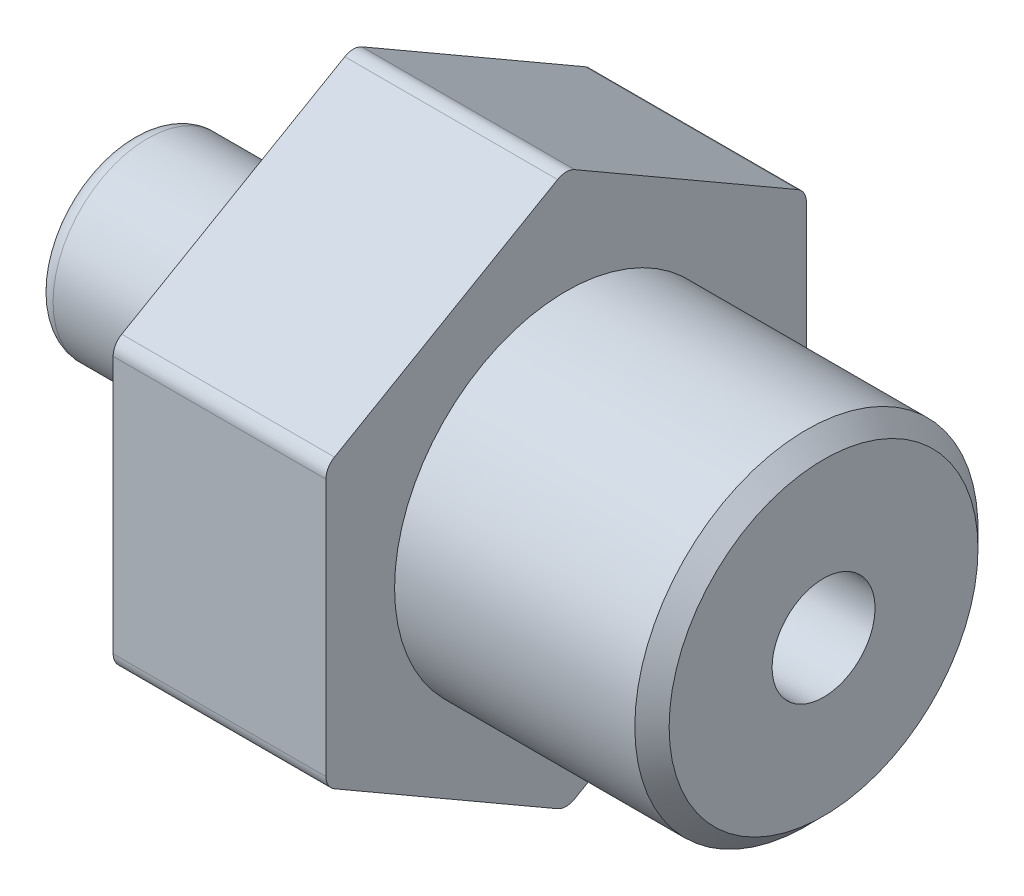
ISO-10303-21;
HEADER;
FILE_DESCRIPTION(('STEP AP214'),'2;1');
FILE_NAME('part.step','',(''),(''),'','','');
FILE_SCHEMA(('AUTOMOTIVE_DESIGN { 1 0 10303 214 1 1 1 1 }'));
ENDSEC;
DATA;
#1=APPLICATION_CONTEXT('core data for automotive mechanical design processes');
#2=APPLICATION_PROTOCOL_DEFINITION('international standard','automotive_design',2000,#1);
#3=PRODUCT_CONTEXT('',#1,'mechanical');
#4=PRODUCT('Part','Part','',(#3));
#5=PRODUCT_RELATED_PRODUCT_CATEGORY('part','',(#4));
#6=PRODUCT_DEFINITION_FORMATION('','',#4);
#7=PRODUCT_DEFINITION_CONTEXT('part definition',#1,'design');
#8=PRODUCT_DEFINITION('design','',#6,#7);
#9=PRODUCT_DEFINITION_SHAPE('','',#8);
#10=(LENGTH_UNIT() NAMED_UNIT(*) SI_UNIT(.MILLI.,.METRE.));
#11=(NAMED_UNIT(*) PLANE_ANGLE_UNIT() SI_UNIT($,.RADIAN.));
#12=(NAMED_UNIT(*) SI_UNIT($,.STERADIAN.) SOLID_ANGLE_UNIT());
#13=UNCERTAINTY_MEASURE_WITH_UNIT(LENGTH_MEASURE(1.E-05),#10,'distance_accuracy_value','');
#14=(GEOMETRIC_REPRESENTATION_CONTEXT(3) GLOBAL_UNCERTAINTY_ASSIGNED_CONTEXT((#13)) GLOBAL_UNIT_ASSIGNED_CONTEXT((#10,
#11,#12)) REPRESENTATION_CONTEXT('',''));
#15=CARTESIAN_POINT('',(0.,0.,0.));
#16=DIRECTION('',(0.,0.,1.));
#17=DIRECTION('',(1.,0.,0.));
#18=AXIS2_PLACEMENT_3D('',#15,#16,#17);
#19=CARTESIAN_POINT('',(-12.7,0.,0.));
#20=DIRECTION('',(-1.,0.,0.));
#21=DIRECTION('',(0.,0.,1.));
#22=AXIS2_PLACEMENT_3D('',#19,#20,#21);
#23=PLANE('',#22);
#24=CARTESIAN_POINT('',(-12.7,0.,0.));
#25=DIRECTION('',(-1.,0.,0.));
#26=DIRECTION('',(0.,0.,1.));
#27=AXIS2_PLACEMENT_3D('',#24,#25,#26);
#28=CIRCLE('',#27,2.25);
#29=CARTESIAN_POINT('',(-12.7,0.,2.25));
#30=VERTEX_POINT('',#29);
#31=EDGE_CURVE('E51',#30,#30,#28,.T.);
#32=ORIENTED_EDGE('',*,*,#31,.T.);
#33=EDGE_LOOP('',(#32));
#34=FACE_BOUND('',#33,.T.);
#35=CARTESIAN_POINT('',(-12.7,0.,0.));
#36=DIRECTION('',(-1.,0.,0.));
#37=DIRECTION('',(0.,0.,1.));
#38=AXIS2_PLACEMENT_3D('',#35,#36,#37);
#39=CIRCLE('',#38,1.5);
#40=CARTESIAN_POINT('',(-12.7,0.,-1.5));
#41=VERTEX_POINT('',#40);
#42=EDGE_CURVE('E59',#41,#41,#39,.T.);
#43=ORIENTED_EDGE('',*,*,#42,.F.);
#44=EDGE_LOOP('',(#43));
#45=FACE_BOUND('',#44,.T.);
#46=ADVANCED_FACE('F44',(#34,#45),#23,.T.);
#47=CARTESIAN_POINT('',(-6.2,0.,0.));
#48=DIRECTION('',(-1.,0.,0.));
#49=DIRECTION('',(0.,0.,1.));
#50=AXIS2_PLACEMENT_3D('',#47,#48,#49);
#51=PLANE('',#50);
#52=CARTESIAN_POINT('',(-6.2,0.,0.));
#53=DIRECTION('',(-1.,0.,0.));
#54=DIRECTION('',(0.,0.,1.));
#55=AXIS2_PLACEMENT_3D('',#52,#53,#54);
#56=CIRCLE('',#55,2.75);
#57=CARTESIAN_POINT('',(-6.2,0.,-2.75));
#58=VERTEX_POINT('',#57);
#59=EDGE_CURVE('E55',#58,#58,#56,.T.);
#60=ORIENTED_EDGE('',*,*,#59,.F.);
#61=EDGE_LOOP('',(#60));
#62=FACE_BOUND('',#61,.T.);
#63=CARTESIAN_POINT('',(-6.2,0.,0.));
#64=DIRECTION('',(-1.,0.,0.));
#65=DIRECTION('',(0.,0.,1.));
#66=AXIS2_PLACEMENT_3D('',#63,#64,#65);
#67=CIRCLE('',#66,1.5);
#68=CARTESIAN_POINT('',(-6.2,0.,-1.5));
#69=VERTEX_POINT('',#68);
#70=EDGE_CURVE('E62',#69,#69,#67,.T.);
#71=ORIENTED_EDGE('',*,*,#70,.T.);
#72=EDGE_LOOP('',(#71));
#73=FACE_BOUND('',#72,.T.);
#74=ADVANCED_FACE('F72',(#62,#73),#51,.F.);
#75=CARTESIAN_POINT('',(-12.7,0.,0.));
#76=DIRECTION('',(1.,0.,0.));
#77=DIRECTION('',(0.,0.,-1.));
#78=AXIS2_PLACEMENT_3D('',#75,#76,#77);
#79=CYLINDRICAL_SURFACE('',#78,2.75);
#80=CARTESIAN_POINT('',(-12.2,0.,0.));
#81=DIRECTION('',(-1.,0.,0.));
#82=DIRECTION('',(0.,0.,1.));
#83=AXIS2_PLACEMENT_3D('',#80,#81,#82);
#84=CIRCLE('',#83,2.75);
#85=CARTESIAN_POINT('',(-12.2,0.,-2.75));
#86=VERTEX_POINT('',#85);
#87=EDGE_CURVE('E11',#86,#86,#84,.F.);
#88=CARTESIAN_POINT('',(-12.2,0.,-2.75));
#89=CARTESIAN_POINT('',(-12.1375,0.,-2.75));
#90=CARTESIAN_POINT('',(-12.075,0.,-2.75));
#91=CARTESIAN_POINT('',(-11.95,0.,-2.75));
#92=CARTESIAN_POINT('',(-11.8875,0.,-2.75));
#93=CARTESIAN_POINT('',(-11.7625,0.,-2.75));
#94=CARTESIAN_POINT('',(-11.7,0.,-2.75));
#95=CARTESIAN_POINT('',(-11.575,0.,-2.75));
#96=CARTESIAN_POINT('',(-11.5125,0.,-2.75));
#97=CARTESIAN_POINT('',(-11.3875,0.,-2.75));
#98=CARTESIAN_POINT('',(-11.325,0.,-2.75));
#99=CARTESIAN_POINT('',(-11.2,0.,-2.75));
#100=CARTESIAN_POINT('',(-11.1375,0.,-2.75));
#101=CARTESIAN_POINT('',(-11.0125,0.,-2.75));
#102=CARTESIAN_POINT('',(-10.95,0.,-2.75));
#103=CARTESIAN_POINT('',(-10.825,0.,-2.75));
#104=CARTESIAN_POINT('',(-10.7625,0.,-2.75));
#105=CARTESIAN_POINT('',(-10.6375,0.,-2.75));
#106=CARTESIAN_POINT('',(-10.575,0.,-2.75));
#107=CARTESIAN_POINT('',(-10.45,0.,-2.75));
#108=CARTESIAN_POINT('',(-10.3875,0.,-2.75));
#109=CARTESIAN_POINT('',(-10.2625,0.,-2.75));
#110=CARTESIAN_POINT('',(-10.2,0.,-2.75));
#111=CARTESIAN_POINT('',(-10.075,0.,-2.75));
#112=CARTESIAN_POINT('',(-10.0125,0.,-2.75));
#113=CARTESIAN_POINT('',(-9.8875,0.,-2.75));
#114=CARTESIAN_POINT('',(-9.825,0.,-2.75));
#115=CARTESIAN_POINT('',(-9.7,0.,-2.75));
#116=CARTESIAN_POINT('',(-9.6375,0.,-2.75));
#117=CARTESIAN_POINT('',(-9.5125,0.,-2.75));
#118=CARTESIAN_POINT('',(-9.45,0.,-2.75));
#119=CARTESIAN_POINT('',(-9.325,0.,-2.75));
#120=CARTESIAN_POINT('',(-9.2625,0.,-2.75));
#121=CARTESIAN_POINT('',(-9.1375,0.,-2.75));
#122=CARTESIAN_POINT('',(-9.075,0.,-2.75));
#123=CARTESIAN_POINT('',(-8.95,0.,-2.75));
#124=CARTESIAN_POINT('',(-8.8875,0.,-2.75));
#125=CARTESIAN_POINT('',(-8.7625,0.,-2.75));
#126=CARTESIAN_POINT('',(-8.7,0.,-2.75));
#127=CARTESIAN_POINT('',(-8.575,0.,-2.75));
#128=CARTESIAN_POINT('',(-8.5125,0.,-2.75));
#129=CARTESIAN_POINT('',(-8.3875,0.,-2.75));
#130=CARTESIAN_POINT('',(-8.325,0.,-2.75));
#131=CARTESIAN_POINT('',(-8.2,0.,-2.75));
#132=CARTESIAN_POINT('',(-8.1375,0.,-2.75));
#133=CARTESIAN_POINT('',(-8.0125,0.,-2.75));
#134=CARTESIAN_POINT('',(-7.95,0.,-2.75));
#135=CARTESIAN_POINT('',(-7.825,0.,-2.75));
#136=CARTESIAN_POINT('',(-7.7625,0.,-2.75));
#137=CARTESIAN_POINT('',(-7.6375,0.,-2.75));
#138=CARTESIAN_POINT('',(-7.575,0.,-2.75));
#139=CARTESIAN_POINT('',(-7.45,0.,-2.75));
#140=CARTESIAN_POINT('',(-7.3875,0.,-2.75));
#141=CARTESIAN_POINT('',(-7.2625,0.,-2.75));
#142=CARTESIAN_POINT('',(-7.2,0.,-2.75));
#143=CARTESIAN_POINT('',(-7.075,0.,-2.75));
#144=CARTESIAN_POINT('',(-7.0125,0.,-2.75));
#145=CARTESIAN_POINT('',(-6.8875,0.,-2.75));
#146=CARTESIAN_POINT('',(-6.825,0.,-2.75));
#147=CARTESIAN_POINT('',(-6.7,0.,-2.75));
#148=CARTESIAN_POINT('',(-6.6375,0.,-2.75));
#149=CARTESIAN_POINT('',(-6.5125,0.,-2.75));
#150=CARTESIAN_POINT('',(-6.45,0.,-2.75));
#151=CARTESIAN_POINT('',(-6.325,0.,-2.75));
#152=CARTESIAN_POINT('',(-6.2625,0.,-2.75));
#153=CARTESIAN_POINT('',(-6.2,0.,-2.75));
#154=B_SPLINE_CURVE_WITH_KNOTS('',3,(#88,#89,#90,#91,#92,#93,#94,#95,#96,#97,#98,#99,#100,#101,
#102,#103,#104,#105,#106,#107,#108,#109,#110,#111,#112,#113,#114,#115,#116,#117,#118,#119,#120,
#121,#122,#123,#124,#125,#126,#127,#128,#129,#130,#131,#132,#133,#134,#135,#136,#137,#138,#139,
#140,#141,#142,#143,#144,#145,#146,#147,#148,#149,#150,#151,#152,#153),.UNSPECIFIED.,.F.,.F.,(4,
2,2,2,2,2,2,2,2,2,2,2,2,2,2,2,2,2,2,2,2,2,2,2,2,2,2,2,2,2,2,2,4),(0.,0.187499999999998,
0.374999999999999,0.562499999999999,0.749999999999999,0.937499999999999,1.125,1.3125,1.5,1.6875,
1.875,2.0625,2.25,2.4375,2.625,2.8125,3.,3.1875,3.375,3.5625,3.75,3.9375,4.125,4.3125,4.5,
4.6875,4.875,5.0625,5.25,5.4375,5.625,5.8125,6.),.UNSPECIFIED.);
#155=EDGE_CURVE('BSEAM77',#86,#58,#154,.T.);
#156=ORIENTED_EDGE('',*,*,#87,.T.);
#157=ORIENTED_EDGE('',*,*,#59,.T.);
#158=ORIENTED_EDGE('',*,*,#155,.T.);
#159=ORIENTED_EDGE('',*,*,#155,.F.);
#160=EDGE_LOOP('',(#156,#158,#157,#159));
#161=FACE_BOUND('',#160,.T.);
#162=ADVANCED_FACE('F77',(#161),#79,.T.);
#163=CARTESIAN_POINT('',(-12.7,0.,0.));
#164=DIRECTION('',(1.,0.,0.));
#165=DIRECTION('',(0.,0.,-1.));
#166=AXIS2_PLACEMENT_3D('',#163,#164,#165);
#167=CYLINDRICAL_SURFACE('',#166,1.5);
#168=CARTESIAN_POINT('',(-12.7,0.,-1.5));
#169=CARTESIAN_POINT('',(-12.6322916666667,0.,-1.5));
#170=CARTESIAN_POINT('',(-12.5645833333333,0.,-1.5));
#171=CARTESIAN_POINT('',(-12.4291666666667,0.,-1.5));
#172=CARTESIAN_POINT('',(-12.3614583333333,0.,-1.5));
#173=CARTESIAN_POINT('',(-12.2260416666667,0.,-1.5));
#174=CARTESIAN_POINT('',(-12.1583333333333,0.,-1.5));
#175=CARTESIAN_POINT('',(-12.0229166666667,0.,-1.5));
#176=CARTESIAN_POINT('',(-11.9552083333333,0.,-1.5));
#177=CARTESIAN_POINT('',(-11.8197916666667,0.,-1.5));
#178=CARTESIAN_POINT('',(-11.7520833333333,0.,-1.5));
#179=CARTESIAN_POINT('',(-11.6166666666667,0.,-1.5));
#180=CARTESIAN_POINT('',(-11.5489583333333,0.,-1.5));
#181=CARTESIAN_POINT('',(-11.4135416666667,0.,-1.5));
#182=CARTESIAN_POINT('',(-11.3458333333333,0.,-1.5));
#183=CARTESIAN_POINT('',(-11.2104166666667,0.,-1.5));
#184=CARTESIAN_POINT('',(-11.1427083333333,0.,-1.5));
#185=CARTESIAN_POINT('',(-11.0072916666667,0.,-1.5));
#186=CARTESIAN_POINT('',(-10.9395833333333,0.,-1.5));
#187=CARTESIAN_POINT('',(-10.8041666666667,0.,-1.5));
#188=CARTESIAN_POINT('',(-10.7364583333333,0.,-1.5));
#189=CARTESIAN_POINT('',(-10.6010416666667,0.,-1.5));
#190=CARTESIAN_POINT('',(-10.5333333333333,0.,-1.5));
#191=CARTESIAN_POINT('',(-10.3979166666667,0.,-1.5));
#192=CARTESIAN_POINT('',(-10.3302083333333,0.,-1.5));
#193=CARTESIAN_POINT('',(-10.1947916666667,0.,-1.5));
#194=CARTESIAN_POINT('',(-10.1270833333333,0.,-1.5));
#195=CARTESIAN_POINT('',(-9.99166666666667,0.,-1.5));
#196=CARTESIAN_POINT('',(-9.92395833333333,0.,-1.5));
#197=CARTESIAN_POINT('',(-9.78854166666667,0.,-1.5));
#198=CARTESIAN_POINT('',(-9.72083333333333,0.,-1.5));
#199=CARTESIAN_POINT('',(-9.58541666666667,0.,-1.5));
#200=CARTESIAN_POINT('',(-9.51770833333333,0.,-1.5));
#201=CARTESIAN_POINT('',(-9.38229166666667,0.,-1.5));
#202=CARTESIAN_POINT('',(-9.31458333333333,0.,-1.5));
#203=CARTESIAN_POINT('',(-9.17916666666667,0.,-1.5));
#204=CARTESIAN_POINT('',(-9.11145833333333,0.,-1.5));
#205=CARTESIAN_POINT('',(-8.97604166666667,0.,-1.5));
#206=CARTESIAN_POINT('',(-8.90833333333333,0.,-1.5));
#207=CARTESIAN_POINT('',(-8.77291666666667,0.,-1.5));
#208=CARTESIAN_POINT('',(-8.70520833333333,0.,-1.5));
#209=CARTESIAN_POINT('',(-8.56979166666667,0.,-1.5));
#210=CARTESIAN_POINT('',(-8.50208333333333,0.,-1.5));
#211=CARTESIAN_POINT('',(-8.36666666666667,0.,-1.5));
#212=CARTESIAN_POINT('',(-8.29895833333333,0.,-1.5));
#213=CARTESIAN_POINT('',(-8.16354166666667,0.,-1.5));
#214=CARTESIAN_POINT('',(-8.09583333333333,0.,-1.5));
#215=CARTESIAN_POINT('',(-7.96041666666667,0.,-1.5));
#216=CARTESIAN_POINT('',(-7.89270833333333,0.,-1.5));
#217=CARTESIAN_POINT('',(-7.75729166666667,0.,-1.5));
#218=CARTESIAN_POINT('',(-7.68958333333333,0.,-1.5));
#219=CARTESIAN_POINT('',(-7.55416666666667,0.,-1.5));
#220=CARTESIAN_POINT('',(-7.48645833333333,0.,-1.5));
#221=CARTESIAN_POINT('',(-7.35104166666667,0.,-1.5));
#222=CARTESIAN_POINT('',(-7.28333333333333,0.,-1.5));
#223=CARTESIAN_POINT('',(-7.14791666666667,0.,-1.5));
#224=CARTESIAN_POINT('',(-7.08020833333333,0.,-1.5));
#225=CARTESIAN_POINT('',(-6.94479166666667,0.,-1.5));
#226=CARTESIAN_POINT('',(-6.87708333333333,0.,-1.5));
#227=CARTESIAN_POINT('',(-6.74166666666667,0.,-1.5));
#228=CARTESIAN_POINT('',(-6.67395833333333,0.,-1.5));
#229=CARTESIAN_POINT('',(-6.53854166666667,0.,-1.5));
#230=CARTESIAN_POINT('',(-6.47083333333333,0.,-1.5));
#231=CARTESIAN_POINT('',(-6.33541666666667,0.,-1.5));
#232=CARTESIAN_POINT('',(-6.26770833333333,0.,-1.5));
#233=CARTESIAN_POINT('',(-6.2,0.,-1.5));
#234=B_SPLINE_CURVE_WITH_KNOTS('',3,(#168,#169,#170,#171,#172,#173,#174,#175,#176,#177,#178,
#179,#180,#181,#182,#183,#184,#185,#186,#187,#188,#189,#190,#191,#192,#193,#194,#195,#196,#197,
#198,#199,#200,#201,#202,#203,#204,#205,#206,#207,#208,#209,#210,#211,#212,#213,#214,#215,#216,
#217,#218,#219,#220,#221,#222,#223,#224,#225,#226,#227,#228,#229,#230,#231,#232,#233),
.UNSPECIFIED.,.F.,.F.,(4,2,2,2,2,2,2,2,2,2,2,2,2,2,2,2,2,2,2,2,2,2,2,2,2,2,2,2,2,2,2,2,4),(0.,
0.203125,0.40625,0.609375000000001,0.812500000000001,1.015625,1.21875,1.421875,1.625,1.828125,
2.03125,2.234375,2.4375,2.640625,2.84375,3.046875,3.25,3.453125,3.65625,3.859375,4.0625,
4.265625,4.46875,4.671875,4.875,5.078125,5.28125,5.484375,5.6875,5.890625,6.09375,6.296875,6.5),.UNSPECIFIED.);
#235=EDGE_CURVE('BSEAM68',#41,#69,#234,.T.);
#236=ORIENTED_EDGE('',*,*,#42,.T.);
#237=ORIENTED_EDGE('',*,*,#70,.F.);
#238=ORIENTED_EDGE('',*,*,#235,.T.);
#239=ORIENTED_EDGE('',*,*,#235,.F.);
#240=EDGE_LOOP('',(#236,#238,#237,#239));
#241=FACE_BOUND('',#240,.T.);
#242=ADVANCED_FACE('F68',(#241),#167,.F.);
#243=CARTESIAN_POINT('',(-12.2,0.,0.));
#244=DIRECTION('',(-1.,0.,0.));
#245=DIRECTION('',(0.,0.,1.));
#246=AXIS2_PLACEMENT_3D('',#243,#244,#245);
#247=TOROIDAL_SURFACE('',#246,2.25,0.5);
#248=ORIENTED_EDGE('',*,*,#87,.F.);
#249=EDGE_LOOP('',(#248));
#250=FACE_BOUND('',#249,.T.);
#251=ORIENTED_EDGE('',*,*,#31,.F.);
#252=EDGE_LOOP('',(#251));
#253=FACE_BOUND('',#252,.T.);
#254=ADVANCED_FACE('F46',(#250,#253),#247,.T.);
#255=CLOSED_SHELL('',(#46,#74,#162,#242,#254));
#256=MANIFOLD_SOLID_BREP('B2',#255);
#257=CARTESIAN_POINT('',(0.,0.,0.));
#258=DIRECTION('',(-1.,0.,0.));
#259=DIRECTION('',(0.,0.,1.));
#260=AXIS2_PLACEMENT_3D('',#257,#258,#259);
#261=CYLINDRICAL_SURFACE('',#260,5.);
#262=CARTESIAN_POINT('',(7.,0.,0.));
#263=DIRECTION('',(-1.,0.,0.));
#264=DIRECTION('',(0.,0.,1.));
#265=AXIS2_PLACEMENT_3D('',#262,#263,#264);
#266=CIRCLE('',#265,5.);
#267=CARTESIAN_POINT('',(7.,0.,5.));
#268=VERTEX_POINT('',#267);
#269=EDGE_CURVE('E256',#268,#268,#266,.T.);
#270=ORIENTED_EDGE('',*,*,#269,.T.);
#271=EDGE_LOOP('',(#270));
#272=FACE_BOUND('',#271,.T.);
#273=CARTESIAN_POINT('',(0.,0.,0.));
#274=DIRECTION('',(-1.,0.,0.));
#275=DIRECTION('',(0.,0.,1.));
#276=AXIS2_PLACEMENT_3D('',#273,#274,#275);
#277=CIRCLE('',#276,5.);
#278=CARTESIAN_POINT('',(0.,0.,5.));
#279=VERTEX_POINT('',#278);
#280=EDGE_CURVE('E253',#279,#279,#277,.T.);
#281=ORIENTED_EDGE('',*,*,#280,.F.);
#282=EDGE_LOOP('',(#281));
#283=FACE_BOUND('',#282,.T.);
#284=ADVANCED_FACE('F120',(#272,#283),#261,.T.);
#285=CARTESIAN_POINT('',(0.,0.,0.));
#286=DIRECTION('',(1.,0.,0.));
#287=DIRECTION('',(0.,0.,-1.));
#288=AXIS2_PLACEMENT_3D('',#285,#286,#287);
#289=PLANE('',#288);
#290=CARTESIAN_POINT('',(0.,0.,0.));
#291=DIRECTION('',(-1.,0.,0.));
#292=DIRECTION('',(0.,0.,1.));
#293=AXIS2_PLACEMENT_3D('',#290,#291,#292);
#294=CIRCLE('',#293,3.);
#295=CARTESIAN_POINT('',(0.,0.,-3.));
#296=VERTEX_POINT('',#295);
#297=EDGE_CURVE('E330',#296,#296,#294,.T.);
#298=ORIENTED_EDGE('',*,*,#297,.T.);
#299=EDGE_LOOP('',(#298));
#300=FACE_BOUND('',#299,.T.);
#301=CARTESIAN_POINT('',(0.,0.,0.));
#302=DIRECTION('',(-1.,0.,0.));
#303=DIRECTION('',(0.,0.,1.));
#304=AXIS2_PLACEMENT_3D('',#301,#302,#303);
#305=CIRCLE('',#304,1.5);
#306=CARTESIAN_POINT('',(0.,0.,1.5));
#307=VERTEX_POINT('',#306);
#308=EDGE_CURVE('E250',#307,#307,#305,.T.);
#309=ORIENTED_EDGE('',*,*,#308,.F.);
#310=EDGE_LOOP('',(#309));
#311=FACE_BOUND('',#310,.T.);
#312=ADVANCED_FACE('F354',(#300,#311),#289,.F.);
#313=CARTESIAN_POINT('',(0.,0.,0.));
#314=DIRECTION('',(-1.,0.,0.));
#315=DIRECTION('',(0.,0.,1.));
#316=AXIS2_PLACEMENT_3D('',#313,#314,#315);
#317=CYLINDRICAL_SURFACE('',#316,1.5);
#318=ORIENTED_EDGE('',*,*,#308,.T.);
#319=EDGE_LOOP('',(#318));
#320=FACE_BOUND('',#319,.T.);
#321=CARTESIAN_POINT('',(7.5,0.,0.));
#322=DIRECTION('',(-1.,0.,0.));
#323=DIRECTION('',(0.,0.,1.));
#324=AXIS2_PLACEMENT_3D('',#321,#322,#323);
#325=CIRCLE('',#324,1.5);
#326=CARTESIAN_POINT('',(7.5,0.,1.5));
#327=VERTEX_POINT('',#326);
#328=EDGE_CURVE('E247',#327,#327,#325,.T.);
#329=ORIENTED_EDGE('',*,*,#328,.F.);
#330=EDGE_LOOP('',(#329));
#331=FACE_BOUND('',#330,.T.);
#332=ADVANCED_FACE('F360',(#320,#331),#317,.F.);
#333=CARTESIAN_POINT('',(7.5,0.,0.));
#334=DIRECTION('',(-1.,0.,0.));
#335=DIRECTION('',(0.,0.,1.));
#336=AXIS2_PLACEMENT_3D('',#333,#334,#335);
#337=PLANE('',#336);
#338=CARTESIAN_POINT('',(7.5,0.,0.));
#339=DIRECTION('',(-1.,0.,0.));
#340=DIRECTION('',(0.,0.,1.));
#341=AXIS2_PLACEMENT_3D('',#338,#339,#340);
#342=CIRCLE('',#341,4.5);
#343=CARTESIAN_POINT('',(7.5,0.,4.5));
#344=VERTEX_POINT('',#343);
#345=EDGE_CURVE('E259',#344,#344,#342,.F.);
#346=ORIENTED_EDGE('',*,*,#345,.T.);
#347=EDGE_LOOP('',(#346));
#348=FACE_BOUND('',#347,.T.);
#349=ORIENTED_EDGE('',*,*,#328,.T.);
#350=EDGE_LOOP('',(#349));
#351=FACE_BOUND('',#350,.T.);
#352=ADVANCED_FACE('F350',(#348,#351),#337,.F.);
#353=CARTESIAN_POINT('',(0.,0.,0.));
#354=DIRECTION('',(-1.,0.,0.));
#355=DIRECTION('',(0.,0.,1.));
#356=AXIS2_PLACEMENT_3D('',#353,#354,#355);
#357=PLANE('',#356);
#358=DIRECTION('',(0.,1.,0.));
#359=VECTOR('',#358,1.);
#360=CARTESIAN_POINT('',(0.,-4.04145188432738,7.));
#361=LINE('',#360,#359);
#362=CARTESIAN_POINT('',(0.,-3.75277674973257,7.));
#363=VERTEX_POINT('',#362);
#364=CARTESIAN_POINT('',(0.,3.75277674973257,7.));
#365=VERTEX_POINT('',#364);
#366=EDGE_CURVE('E227',#363,#365,#361,.T.);
#367=ORIENTED_EDGE('',*,*,#366,.F.);
#368=CARTESIAN_POINT('',(0.,-3.75277674973257,6.5));
#369=DIRECTION('',(-1.,0.,0.));
#370=DIRECTION('',(0.,0.,1.));
#371=AXIS2_PLACEMENT_3D('',#368,#369,#370);
#372=CIRCLE('',#371,0.5);
#373=CARTESIAN_POINT('',(0.,-4.18578945162479,6.75));
#374=VERTEX_POINT('',#373);
#375=EDGE_CURVE('E210',#363,#374,#372,.F.);
#376=ORIENTED_EDGE('',*,*,#375,.T.);
#377=DIRECTION('',(0.,0.5,0.866025403784439));
#378=VECTOR('',#377,1.);
#379=CARTESIAN_POINT('',(0.,-8.08290376865476,0.));
#380=LINE('',#379,#378);
#381=CARTESIAN_POINT('',(0.,-7.93856620135736,0.249999999999996));
#382=VERTEX_POINT('',#381);
#383=EDGE_CURVE('E238',#382,#374,#380,.T.);
#384=ORIENTED_EDGE('',*,*,#383,.F.);
#385=CARTESIAN_POINT('',(0.,-7.50555349946514,0.));
#386=DIRECTION('',(-1.,0.,0.));
#387=DIRECTION('',(0.,0.,1.));
#388=AXIS2_PLACEMENT_3D('',#385,#386,#387);
#389=CIRCLE('',#388,0.5);
#390=CARTESIAN_POINT('',(0.,-7.93856620135736,-0.250000000000005));
#391=VERTEX_POINT('',#390);
#392=EDGE_CURVE('E231',#382,#391,#389,.F.);
#393=ORIENTED_EDGE('',*,*,#392,.T.);
#394=DIRECTION('',(0.,-0.5,0.866025403784438));
#395=VECTOR('',#394,1.);
#396=CARTESIAN_POINT('',(0.,-4.04145188432738,-7.));
#397=LINE('',#396,#395);
#398=CARTESIAN_POINT('',(0.,-4.18578945162479,-6.75));
#399=VERTEX_POINT('',#398);
#400=EDGE_CURVE('E243',#399,#391,#397,.T.);
#401=ORIENTED_EDGE('',*,*,#400,.F.);
#402=CARTESIAN_POINT('',(0.,-3.75277674973257,-6.5));
#403=DIRECTION('',(-1.,0.,0.));
#404=DIRECTION('',(0.,0.,1.));
#405=AXIS2_PLACEMENT_3D('',#402,#403,#404);
#406=CIRCLE('',#405,0.5);
#407=CARTESIAN_POINT('',(0.,-3.75277674973257,-7.));
#408=VERTEX_POINT('',#407);
#409=EDGE_CURVE('E264',#399,#408,#406,.F.);
#410=ORIENTED_EDGE('',*,*,#409,.T.);
#411=DIRECTION('',(0.,-1.,0.));
#412=VECTOR('',#411,1.);
#413=CARTESIAN_POINT('',(0.,4.04145188432739,-7.));
#414=LINE('',#413,#412);
#415=CARTESIAN_POINT('',(0.,3.75277674973257,-7.));
#416=VERTEX_POINT('',#415);
#417=EDGE_CURVE('E305',#416,#408,#414,.T.);
#418=ORIENTED_EDGE('',*,*,#417,.F.);
#419=CARTESIAN_POINT('',(0.,3.75277674973257,-6.5));
#420=DIRECTION('',(-1.,0.,0.));
#421=DIRECTION('',(0.,0.,1.));
#422=AXIS2_PLACEMENT_3D('',#419,#420,#421);
#423=CIRCLE('',#422,0.5);
#424=CARTESIAN_POINT('',(0.,4.18578945162479,-6.75));
#425=VERTEX_POINT('',#424);
#426=EDGE_CURVE('E266',#416,#425,#423,.F.);
#427=ORIENTED_EDGE('',*,*,#426,.T.);
#428=DIRECTION('',(0.,-0.5,-0.866025403784439));
#429=VECTOR('',#428,1.);
#430=CARTESIAN_POINT('',(0.,8.08290376865476,0.));
#431=LINE('',#430,#429);
#432=CARTESIAN_POINT('',(0.,7.93856620135736,-0.250000000000002));
#433=VERTEX_POINT('',#432);
#434=EDGE_CURVE('E313',#433,#425,#431,.T.);
#435=ORIENTED_EDGE('',*,*,#434,.F.);
#436=CARTESIAN_POINT('',(0.,7.50555349946514,0.));
#437=DIRECTION('',(-1.,0.,0.));
#438=DIRECTION('',(0.,0.,1.));
#439=AXIS2_PLACEMENT_3D('',#436,#437,#438);
#440=CIRCLE('',#439,0.5);
#441=CARTESIAN_POINT('',(0.,7.93856620135736,0.249999999999999));
#442=VERTEX_POINT('',#441);
#443=EDGE_CURVE('E268',#433,#442,#440,.F.);
#444=ORIENTED_EDGE('',*,*,#443,.T.);
#445=DIRECTION('',(0.,0.5,-0.866025403784439));
#446=VECTOR('',#445,1.);
#447=CARTESIAN_POINT('',(0.,4.04145188432738,7.));
#448=LINE('',#447,#446);
#449=CARTESIAN_POINT('',(0.,4.18578945162479,6.75));
#450=VERTEX_POINT('',#449);
#451=EDGE_CURVE('E315',#450,#442,#448,.T.);
#452=ORIENTED_EDGE('',*,*,#451,.F.);
#453=CARTESIAN_POINT('',(0.,3.75277674973257,6.5));
#454=DIRECTION('',(-1.,0.,0.));
#455=DIRECTION('',(0.,0.,1.));
#456=AXIS2_PLACEMENT_3D('',#453,#454,#455);
#457=CIRCLE('',#456,0.5);
#458=EDGE_CURVE('E221',#450,#365,#457,.F.);
#459=ORIENTED_EDGE('',*,*,#458,.T.);
#460=EDGE_LOOP('',(#367,#376,#384,#393,#401,#410,#418,#427,#435,#444,#452,#459));
#461=FACE_BOUND('',#460,.T.);
#462=ORIENTED_EDGE('',*,*,#280,.T.);
#463=EDGE_LOOP('',(#462));
#464=FACE_BOUND('',#463,.T.);
#465=ADVANCED_FACE('F234',(#461,#464),#357,.F.);
#466=CARTESIAN_POINT('',(-6.2,0.,0.));
#467=DIRECTION('',(-1.,0.,0.));
#468=DIRECTION('',(0.,0.,1.));
#469=AXIS2_PLACEMENT_3D('',#466,#467,#468);
#470=PLANE('',#469);
#471=DIRECTION('',(0.,0.5,0.866025403784439));
#472=VECTOR('',#471,1.);
#473=CARTESIAN_POINT('',(-6.2,-8.08290376865476,0.));
#474=LINE('',#473,#472);
#475=CARTESIAN_POINT('',(-6.2,-7.93856620135736,0.249999999999996));
#476=VERTEX_POINT('',#475);
#477=CARTESIAN_POINT('',(-6.2,-4.18578945162479,6.75));
#478=VERTEX_POINT('',#477);
#479=EDGE_CURVE('E322',#476,#478,#474,.T.);
#480=ORIENTED_EDGE('',*,*,#479,.T.);
#481=CARTESIAN_POINT('',(-6.2,-3.75277674973257,6.5));
#482=DIRECTION('',(-1.,0.,0.));
#483=DIRECTION('',(0.,0.,1.));
#484=AXIS2_PLACEMENT_3D('',#481,#482,#483);
#485=CIRCLE('',#484,0.5);
#486=CARTESIAN_POINT('',(-6.2,-3.75277674973257,7.));
#487=VERTEX_POINT('',#486);
#488=EDGE_CURVE('E283',#478,#487,#485,.T.);
#489=ORIENTED_EDGE('',*,*,#488,.T.);
#490=DIRECTION('',(0.,1.,0.));
#491=VECTOR('',#490,1.);
#492=CARTESIAN_POINT('',(-6.2,-4.04145188432738,7.));
#493=LINE('',#492,#491);
#494=CARTESIAN_POINT('',(-6.2,3.75277674973257,7.));
#495=VERTEX_POINT('',#494);
#496=EDGE_CURVE('E230',#487,#495,#493,.T.);
#497=ORIENTED_EDGE('',*,*,#496,.T.);
#498=CARTESIAN_POINT('',(-6.2,3.75277674973257,6.5));
#499=DIRECTION('',(-1.,0.,0.));
#500=DIRECTION('',(0.,0.,1.));
#501=AXIS2_PLACEMENT_3D('',#498,#499,#500);
#502=CIRCLE('',#501,0.5);
#503=CARTESIAN_POINT('',(-6.2,4.18578945162479,6.75));
#504=VERTEX_POINT('',#503);
#505=EDGE_CURVE('E281',#495,#504,#502,.T.);
#506=ORIENTED_EDGE('',*,*,#505,.T.);
#507=DIRECTION('',(0.,0.5,-0.866025403784439));
#508=VECTOR('',#507,1.);
#509=CARTESIAN_POINT('',(-6.2,4.04145188432738,7.));
#510=LINE('',#509,#508);
#511=CARTESIAN_POINT('',(-6.2,7.93856620135736,0.249999999999999));
#512=VERTEX_POINT('',#511);
#513=EDGE_CURVE('E237',#504,#512,#510,.T.);
#514=ORIENTED_EDGE('',*,*,#513,.T.);
#515=CARTESIAN_POINT('',(-6.2,7.50555349946514,0.));
#516=DIRECTION('',(-1.,0.,0.));
#517=DIRECTION('',(0.,0.,1.));
#518=AXIS2_PLACEMENT_3D('',#515,#516,#517);
#519=CIRCLE('',#518,0.5);
#520=CARTESIAN_POINT('',(-6.2,7.93856620135736,-0.250000000000002));
#521=VERTEX_POINT('',#520);
#522=EDGE_CURVE('E279',#512,#521,#519,.T.);
#523=ORIENTED_EDGE('',*,*,#522,.T.);
#524=DIRECTION('',(0.,-0.5,-0.866025403784439));
#525=VECTOR('',#524,1.);
#526=CARTESIAN_POINT('',(-6.2,8.08290376865476,0.));
#527=LINE('',#526,#525);
#528=CARTESIAN_POINT('',(-6.2,4.18578945162479,-6.75));
#529=VERTEX_POINT('',#528);
#530=EDGE_CURVE('E241',#521,#529,#527,.T.);
#531=ORIENTED_EDGE('',*,*,#530,.T.);
#532=CARTESIAN_POINT('',(-6.2,3.75277674973257,-6.5));
#533=DIRECTION('',(-1.,0.,0.));
#534=DIRECTION('',(0.,0.,1.));
#535=AXIS2_PLACEMENT_3D('',#532,#533,#534);
#536=CIRCLE('',#535,0.5);
#537=CARTESIAN_POINT('',(-6.2,3.75277674973257,-7.));
#538=VERTEX_POINT('',#537);
#539=EDGE_CURVE('E277',#529,#538,#536,.T.);
#540=ORIENTED_EDGE('',*,*,#539,.T.);
#541=DIRECTION('',(0.,-1.,0.));
#542=VECTOR('',#541,1.);
#543=CARTESIAN_POINT('',(-6.2,4.04145188432739,-7.));
#544=LINE('',#543,#542);
#545=CARTESIAN_POINT('',(-6.2,-3.75277674973257,-7.));
#546=VERTEX_POINT('',#545);
#547=EDGE_CURVE('E307',#538,#546,#544,.T.);
#548=ORIENTED_EDGE('',*,*,#547,.T.);
#549=CARTESIAN_POINT('',(-6.2,-3.75277674973257,-6.5));
#550=DIRECTION('',(-1.,0.,0.));
#551=DIRECTION('',(0.,0.,1.));
#552=AXIS2_PLACEMENT_3D('',#549,#550,#551);
#553=CIRCLE('',#552,0.5);
#554=CARTESIAN_POINT('',(-6.2,-4.18578945162479,-6.75));
#555=VERTEX_POINT('',#554);
#556=EDGE_CURVE('E141',#546,#555,#553,.T.);
#557=ORIENTED_EDGE('',*,*,#556,.T.);
#558=DIRECTION('',(0.,-0.5,0.866025403784438));
#559=VECTOR('',#558,1.);
#560=CARTESIAN_POINT('',(-6.2,-4.04145188432738,-7.));
#561=LINE('',#560,#559);
#562=CARTESIAN_POINT('',(-6.2,-7.93856620135736,-0.250000000000005));
#563=VERTEX_POINT('',#562);
#564=EDGE_CURVE('E325',#555,#563,#561,.T.);
#565=ORIENTED_EDGE('',*,*,#564,.T.);
#566=CARTESIAN_POINT('',(-6.2,-7.50555349946514,0.));
#567=DIRECTION('',(-1.,0.,0.));
#568=DIRECTION('',(0.,0.,1.));
#569=AXIS2_PLACEMENT_3D('',#566,#567,#568);
#570=CIRCLE('',#569,0.5);
#571=EDGE_CURVE('E274',#563,#476,#570,.T.);
#572=ORIENTED_EDGE('',*,*,#571,.T.);
#573=EDGE_LOOP('',(#480,#489,#497,#506,#514,#523,#531,#540,#548,#557,#565,#572));
#574=FACE_BOUND('',#573,.T.);
#575=CARTESIAN_POINT('',(-6.2,0.,0.));
#576=DIRECTION('',(-1.,0.,0.));
#577=DIRECTION('',(0.,0.,1.));
#578=AXIS2_PLACEMENT_3D('',#575,#576,#577);
#579=CIRCLE('',#578,3.);
#580=CARTESIAN_POINT('',(-6.2,0.,-3.));
#581=VERTEX_POINT('',#580);
#582=EDGE_CURVE('E320',#581,#581,#579,.T.);
#583=ORIENTED_EDGE('',*,*,#582,.F.);
#584=EDGE_LOOP('',(#583));
#585=FACE_BOUND('',#584,.T.);
#586=ADVANCED_FACE('F339',(#574,#585),#470,.T.);
#587=CARTESIAN_POINT('',(-6.2,4.04145188432738,7.));
#588=DIRECTION('',(0.,-0.866025403784439,-0.5));
#589=DIRECTION('',(0.,0.5,-0.866025403784439));
#590=AXIS2_PLACEMENT_3D('',#587,#588,#589);
#591=PLANE('',#590);
#592=ORIENTED_EDGE('',*,*,#513,.F.);
#593=DIRECTION('',(1.,0.,0.));
#594=VECTOR('',#593,1.);
#595=CARTESIAN_POINT('',(-6.2,4.18578945162479,6.75));
#596=LINE('',#595,#594);
#597=EDGE_CURVE('E287',#504,#450,#596,.T.);
#598=ORIENTED_EDGE('',*,*,#597,.T.);
#599=ORIENTED_EDGE('',*,*,#451,.T.);
#600=DIRECTION('',(1.,0.,0.));
#601=VECTOR('',#600,1.);
#602=CARTESIAN_POINT('',(-6.2,7.93856620135736,0.249999999999999));
#603=LINE('',#602,#601);
#604=EDGE_CURVE('E285',#442,#512,#603,.F.);
#605=ORIENTED_EDGE('',*,*,#604,.T.);
#606=EDGE_LOOP('',(#592,#598,#599,#605));
#607=FACE_BOUND('',#606,.T.);
#608=ADVANCED_FACE('F341',(#607),#591,.F.);
#609=CARTESIAN_POINT('',(-6.2,8.08290376865476,0.));
#610=DIRECTION('',(0.,-0.866025403784439,0.5));
#611=DIRECTION('',(0.,-0.5,-0.866025403784439));
#612=AXIS2_PLACEMENT_3D('',#609,#610,#611);
#613=PLANE('',#612);
#614=ORIENTED_EDGE('',*,*,#530,.F.);
#615=DIRECTION('',(1.,0.,0.));
#616=VECTOR('',#615,1.);
#617=CARTESIAN_POINT('',(-6.2,7.93856620135736,-0.250000000000002));
#618=LINE('',#617,#616);
#619=EDGE_CURVE('E292',#521,#433,#618,.T.);
#620=ORIENTED_EDGE('',*,*,#619,.T.);
#621=ORIENTED_EDGE('',*,*,#434,.T.);
#622=DIRECTION('',(1.,0.,0.));
#623=VECTOR('',#622,1.);
#624=CARTESIAN_POINT('',(-6.2,4.18578945162479,-6.75));
#625=LINE('',#624,#623);
#626=EDGE_CURVE('E290',#425,#529,#625,.F.);
#627=ORIENTED_EDGE('',*,*,#626,.T.);
#628=EDGE_LOOP('',(#614,#620,#621,#627));
#629=FACE_BOUND('',#628,.T.);
#630=ADVANCED_FACE('F347',(#629),#613,.F.);
#631=CARTESIAN_POINT('',(-6.2,4.04145188432739,-7.));
#632=DIRECTION('',(0.,0.,1.));
#633=DIRECTION('',(0.,-1.,0.));
#634=AXIS2_PLACEMENT_3D('',#631,#632,#633);
#635=PLANE('',#634);
#636=ORIENTED_EDGE('',*,*,#547,.F.);
#637=DIRECTION('',(1.,0.,0.));
#638=VECTOR('',#637,1.);
#639=CARTESIAN_POINT('',(-6.2,3.75277674973257,-7.));
#640=LINE('',#639,#638);
#641=EDGE_CURVE('E297',#538,#416,#640,.T.);
#642=ORIENTED_EDGE('',*,*,#641,.T.);
#643=ORIENTED_EDGE('',*,*,#417,.T.);
#644=DIRECTION('',(1.,0.,0.));
#645=VECTOR('',#644,1.);
#646=CARTESIAN_POINT('',(-6.2,-3.75277674973257,-7.));
#647=LINE('',#646,#645);
#648=EDGE_CURVE('E295',#408,#546,#647,.F.);
#649=ORIENTED_EDGE('',*,*,#648,.T.);
#650=EDGE_LOOP('',(#636,#642,#643,#649));
#651=FACE_BOUND('',#650,.T.);
#652=ADVANCED_FACE('F304',(#651),#635,.F.);
#653=CARTESIAN_POINT('',(-6.2,-4.04145188432738,-7.));
#654=DIRECTION('',(0.,0.866025403784438,0.5));
#655=DIRECTION('',(0.,-0.5,0.866025403784439));
#656=AXIS2_PLACEMENT_3D('',#653,#654,#655);
#657=PLANE('',#656);
#658=ORIENTED_EDGE('',*,*,#564,.F.);
#659=DIRECTION('',(1.,0.,0.));
#660=VECTOR('',#659,1.);
#661=CARTESIAN_POINT('',(-6.2,-4.18578945162479,-6.75));
#662=LINE('',#661,#660);
#663=EDGE_CURVE('E42',#555,#399,#662,.T.);
#664=ORIENTED_EDGE('',*,*,#663,.T.);
#665=ORIENTED_EDGE('',*,*,#400,.T.);
#666=DIRECTION('',(1.,0.,0.));
#667=VECTOR('',#666,1.);
#668=CARTESIAN_POINT('',(-6.2,-7.93856620135736,-0.250000000000005));
#669=LINE('',#668,#667);
#670=EDGE_CURVE('E128',#391,#563,#669,.F.);
#671=ORIENTED_EDGE('',*,*,#670,.T.);
#672=EDGE_LOOP('',(#658,#664,#665,#671));
#673=FACE_BOUND('',#672,.T.);
#674=ADVANCED_FACE('F390',(#673),#657,.F.);
#675=CARTESIAN_POINT('',(-6.2,-8.08290376865476,0.));
#676=DIRECTION('',(0.,0.866025403784439,-0.5));
#677=DIRECTION('',(0.,0.5,0.866025403784439));
#678=AXIS2_PLACEMENT_3D('',#675,#676,#677);
#679=PLANE('',#678);
#680=ORIENTED_EDGE('',*,*,#383,.T.);
#681=DIRECTION('',(1.,0.,0.));
#682=VECTOR('',#681,1.);
#683=CARTESIAN_POINT('',(-6.2,-4.18578945162479,6.75));
#684=LINE('',#683,#682);
#685=EDGE_CURVE('E215',#374,#478,#684,.F.);
#686=ORIENTED_EDGE('',*,*,#685,.T.);
#687=ORIENTED_EDGE('',*,*,#479,.F.);
#688=DIRECTION('',(1.,0.,0.));
#689=VECTOR('',#688,1.);
#690=CARTESIAN_POINT('',(-6.2,-7.93856620135736,0.249999999999996));
#691=LINE('',#690,#689);
#692=EDGE_CURVE('E220',#476,#382,#691,.T.);
#693=ORIENTED_EDGE('',*,*,#692,.T.);
#694=EDGE_LOOP('',(#680,#686,#687,#693));
#695=FACE_BOUND('',#694,.T.);
#696=ADVANCED_FACE('F395',(#695),#679,.F.);
#697=CARTESIAN_POINT('',(-6.2,-4.04145188432738,7.));
#698=DIRECTION('',(0.,0.,-1.));
#699=DIRECTION('',(0.,1.,0.));
#700=AXIS2_PLACEMENT_3D('',#697,#698,#699);
#701=PLANE('',#700);
#702=ORIENTED_EDGE('',*,*,#496,.F.);
#703=DIRECTION('',(1.,0.,0.));
#704=VECTOR('',#703,1.);
#705=CARTESIAN_POINT('',(-6.2,-3.75277674973257,7.));
#706=LINE('',#705,#704);
#707=EDGE_CURVE('E214',#487,#363,#706,.T.);
#708=ORIENTED_EDGE('',*,*,#707,.T.);
#709=ORIENTED_EDGE('',*,*,#366,.T.);
#710=DIRECTION('',(1.,0.,0.));
#711=VECTOR('',#710,1.);
#712=CARTESIAN_POINT('',(-6.2,3.75277674973257,7.));
#713=LINE('',#712,#711);
#714=EDGE_CURVE('E232',#365,#495,#713,.F.);
#715=ORIENTED_EDGE('',*,*,#714,.T.);
#716=EDGE_LOOP('',(#702,#708,#709,#715));
#717=FACE_BOUND('',#716,.T.);
#718=ADVANCED_FACE('F226',(#717),#701,.F.);
#719=CARTESIAN_POINT('',(-6.2,0.,0.));
#720=DIRECTION('',(1.,0.,0.));
#721=DIRECTION('',(0.,0.,-1.));
#722=AXIS2_PLACEMENT_3D('',#719,#720,#721);
#723=CYLINDRICAL_SURFACE('',#722,3.);
#724=CARTESIAN_POINT('',(-6.2,0.,-3.));
#725=CARTESIAN_POINT('',(-6.13541666666667,0.,-3.));
#726=CARTESIAN_POINT('',(-6.07083333333333,0.,-3.));
#727=CARTESIAN_POINT('',(-5.94166666666667,0.,-3.));
#728=CARTESIAN_POINT('',(-5.87708333333333,0.,-3.));
#729=CARTESIAN_POINT('',(-5.74791666666667,0.,-3.));
#730=CARTESIAN_POINT('',(-5.68333333333333,0.,-3.));
#731=CARTESIAN_POINT('',(-5.55416666666667,0.,-3.));
#732=CARTESIAN_POINT('',(-5.48958333333333,0.,-3.));
#733=CARTESIAN_POINT('',(-5.36041666666667,0.,-3.));
#734=CARTESIAN_POINT('',(-5.29583333333333,0.,-3.));
#735=CARTESIAN_POINT('',(-5.16666666666667,0.,-3.));
#736=CARTESIAN_POINT('',(-5.10208333333333,0.,-3.));
#737=CARTESIAN_POINT('',(-4.97291666666667,0.,-3.));
#738=CARTESIAN_POINT('',(-4.90833333333333,0.,-3.));
#739=CARTESIAN_POINT('',(-4.77916666666667,0.,-3.));
#740=CARTESIAN_POINT('',(-4.71458333333333,0.,-3.));
#741=CARTESIAN_POINT('',(-4.58541666666667,0.,-3.));
#742=CARTESIAN_POINT('',(-4.52083333333333,0.,-3.));
#743=CARTESIAN_POINT('',(-4.39166666666667,0.,-3.));
#744=CARTESIAN_POINT('',(-4.32708333333333,0.,-3.));
#745=CARTESIAN_POINT('',(-4.19791666666667,0.,-3.));
#746=CARTESIAN_POINT('',(-4.13333333333333,0.,-3.));
#747=CARTESIAN_POINT('',(-4.00416666666667,0.,-3.));
#748=CARTESIAN_POINT('',(-3.93958333333333,0.,-3.));
#749=CARTESIAN_POINT('',(-3.81041666666667,0.,-3.));
#750=CARTESIAN_POINT('',(-3.74583333333333,0.,-3.));
#751=CARTESIAN_POINT('',(-3.61666666666667,0.,-3.));
#752=CARTESIAN_POINT('',(-3.55208333333333,0.,-3.));
#753=CARTESIAN_POINT('',(-3.42291666666667,0.,-3.));
#754=CARTESIAN_POINT('',(-3.35833333333333,0.,-3.));
#755=CARTESIAN_POINT('',(-3.22916666666667,0.,-3.));
#756=CARTESIAN_POINT('',(-3.16458333333333,0.,-3.));
#757=CARTESIAN_POINT('',(-3.03541666666667,0.,-3.));
#758=CARTESIAN_POINT('',(-2.97083333333333,0.,-3.));
#759=CARTESIAN_POINT('',(-2.84166666666667,0.,-3.));
#760=CARTESIAN_POINT('',(-2.77708333333333,0.,-3.));
#761=CARTESIAN_POINT('',(-2.64791666666667,0.,-3.));
#762=CARTESIAN_POINT('',(-2.58333333333333,0.,-3.));
#763=CARTESIAN_POINT('',(-2.45416666666667,0.,-3.));
#764=CARTESIAN_POINT('',(-2.38958333333333,0.,-3.));
#765=CARTESIAN_POINT('',(-2.26041666666667,0.,-3.));
#766=CARTESIAN_POINT('',(-2.19583333333333,0.,-3.));
#767=CARTESIAN_POINT('',(-2.06666666666667,0.,-3.));
#768=CARTESIAN_POINT('',(-2.00208333333333,0.,-3.));
#769=CARTESIAN_POINT('',(-1.87291666666667,0.,-3.));
#770=CARTESIAN_POINT('',(-1.80833333333333,0.,-3.));
#771=CARTESIAN_POINT('',(-1.67916666666667,0.,-3.));
#772=CARTESIAN_POINT('',(-1.61458333333333,0.,-3.));
#773=CARTESIAN_POINT('',(-1.48541666666667,0.,-3.));
#774=CARTESIAN_POINT('',(-1.42083333333333,0.,-3.));
#775=CARTESIAN_POINT('',(-1.29166666666667,0.,-3.));
#776=CARTESIAN_POINT('',(-1.22708333333333,0.,-3.));
#777=CARTESIAN_POINT('',(-1.09791666666667,0.,-3.));
#778=CARTESIAN_POINT('',(-1.03333333333333,0.,-3.));
#779=CARTESIAN_POINT('',(-0.904166666666667,0.,-3.));
#780=CARTESIAN_POINT('',(-0.839583333333333,0.,-3.));
#781=CARTESIAN_POINT('',(-0.710416666666666,0.,-3.));
#782=CARTESIAN_POINT('',(-0.645833333333333,0.,-3.));
#783=CARTESIAN_POINT('',(-0.516666666666667,0.,-3.));
#784=CARTESIAN_POINT('',(-0.452083333333333,0.,-3.));
#785=CARTESIAN_POINT('',(-0.322916666666667,0.,-3.));
#786=CARTESIAN_POINT('',(-0.258333333333334,0.,-3.));
#787=CARTESIAN_POINT('',(-0.129166666666667,0.,-3.));
#788=CARTESIAN_POINT('',(-0.0645833333333335,0.,-3.));
#789=CARTESIAN_POINT('',(0.,0.,-3.));
#790=B_SPLINE_CURVE_WITH_KNOTS('',3,(#724,#725,#726,#727,#728,#729,#730,#731,#732,#733,#734,
#735,#736,#737,#738,#739,#740,#741,#742,#743,#744,#745,#746,#747,#748,#749,#750,#751,#752,#753,
#754,#755,#756,#757,#758,#759,#760,#761,#762,#763,#764,#765,#766,#767,#768,#769,#770,#771,#772,
#773,#774,#775,#776,#777,#778,#779,#780,#781,#782,#783,#784,#785,#786,#787,#788,#789),
.UNSPECIFIED.,.F.,.F.,(4,2,2,2,2,2,2,2,2,2,2,2,2,2,2,2,2,2,2,2,2,2,2,2,2,2,2,2,2,2,2,2,4),(0.,
0.193749999999999,0.3875,0.581249999999999,0.775,0.968749999999999,1.1625,1.35625,1.55,1.74375,
1.9375,2.13125,2.325,2.51875,2.7125,2.90625,3.1,3.29375,3.4875,3.68125,3.875,4.06875,4.2625,
4.45625,4.65,4.84375,5.0375,5.23125,5.425,5.61875,5.8125,6.00625,6.2),.UNSPECIFIED.);
#791=EDGE_CURVE('BSEAM336',#581,#296,#790,.T.);
#792=ORIENTED_EDGE('',*,*,#582,.T.);
#793=ORIENTED_EDGE('',*,*,#297,.F.);
#794=ORIENTED_EDGE('',*,*,#791,.T.);
#795=ORIENTED_EDGE('',*,*,#791,.F.);
#796=EDGE_LOOP('',(#792,#794,#793,#795));
#797=FACE_BOUND('',#796,.T.);
#798=ADVANCED_FACE('F336',(#797),#723,.F.);
#799=CARTESIAN_POINT('',(7.,0.,0.));
#800=DIRECTION('',(-1.,0.,0.));
#801=DIRECTION('',(0.,0.,1.));
#802=AXIS2_PLACEMENT_3D('',#799,#800,#801);
#803=CONICAL_SURFACE('',#802,5.,0.785398163397451);
#804=ORIENTED_EDGE('',*,*,#345,.F.);
#805=EDGE_LOOP('',(#804));
#806=FACE_BOUND('',#805,.T.);
#807=ORIENTED_EDGE('',*,*,#269,.F.);
#808=EDGE_LOOP('',(#807));
#809=FACE_BOUND('',#808,.T.);
#810=ADVANCED_FACE('F366',(#806,#809),#803,.T.);
#811=CARTESIAN_POINT('',(-6.2,-3.75277674973257,6.5));
#812=DIRECTION('',(1.,0.,0.));
#813=DIRECTION('',(0.,0.,-1.));
#814=AXIS2_PLACEMENT_3D('',#811,#812,#813);
#815=CYLINDRICAL_SURFACE('',#814,0.5);
#816=ORIENTED_EDGE('',*,*,#488,.F.);
#817=ORIENTED_EDGE('',*,*,#685,.F.);
#818=ORIENTED_EDGE('',*,*,#375,.F.);
#819=ORIENTED_EDGE('',*,*,#707,.F.);
#820=EDGE_LOOP('',(#816,#817,#818,#819));
#821=FACE_BOUND('',#820,.T.);
#822=ADVANCED_FACE('F213',(#821),#815,.T.);
#823=CARTESIAN_POINT('',(-6.2,3.75277674973257,6.5));
#824=DIRECTION('',(1.,0.,0.));
#825=DIRECTION('',(0.,0.,-1.));
#826=AXIS2_PLACEMENT_3D('',#823,#824,#825);
#827=CYLINDRICAL_SURFACE('',#826,0.5);
#828=ORIENTED_EDGE('',*,*,#505,.F.);
#829=ORIENTED_EDGE('',*,*,#714,.F.);
#830=ORIENTED_EDGE('',*,*,#458,.F.);
#831=ORIENTED_EDGE('',*,*,#597,.F.);
#832=EDGE_LOOP('',(#828,#829,#830,#831));
#833=FACE_BOUND('',#832,.T.);
#834=ADVANCED_FACE('F372',(#833),#827,.T.);
#835=CARTESIAN_POINT('',(-6.2,7.50555349946514,0.));
#836=DIRECTION('',(1.,0.,0.));
#837=DIRECTION('',(0.,0.,-1.));
#838=AXIS2_PLACEMENT_3D('',#835,#836,#837);
#839=CYLINDRICAL_SURFACE('',#838,0.5);
#840=ORIENTED_EDGE('',*,*,#522,.F.);
#841=ORIENTED_EDGE('',*,*,#604,.F.);
#842=ORIENTED_EDGE('',*,*,#443,.F.);
#843=ORIENTED_EDGE('',*,*,#619,.F.);
#844=EDGE_LOOP('',(#840,#841,#842,#843));
#845=FACE_BOUND('',#844,.T.);
#846=ADVANCED_FACE('F375',(#845),#839,.T.);
#847=CARTESIAN_POINT('',(-6.2,3.75277674973257,-6.5));
#848=DIRECTION('',(1.,0.,0.));
#849=DIRECTION('',(0.,0.,-1.));
#850=AXIS2_PLACEMENT_3D('',#847,#848,#849);
#851=CYLINDRICAL_SURFACE('',#850,0.5);
#852=ORIENTED_EDGE('',*,*,#539,.F.);
#853=ORIENTED_EDGE('',*,*,#626,.F.);
#854=ORIENTED_EDGE('',*,*,#426,.F.);
#855=ORIENTED_EDGE('',*,*,#641,.F.);
#856=EDGE_LOOP('',(#852,#853,#854,#855));
#857=FACE_BOUND('',#856,.T.);
#858=ADVANCED_FACE('F379',(#857),#851,.T.);
#859=CARTESIAN_POINT('',(-6.2,-3.75277674973257,-6.5));
#860=DIRECTION('',(1.,0.,0.));
#861=DIRECTION('',(0.,0.,-1.));
#862=AXIS2_PLACEMENT_3D('',#859,#860,#861);
#863=CYLINDRICAL_SURFACE('',#862,0.5);
#864=ORIENTED_EDGE('',*,*,#556,.F.);
#865=ORIENTED_EDGE('',*,*,#648,.F.);
#866=ORIENTED_EDGE('',*,*,#409,.F.);
#867=ORIENTED_EDGE('',*,*,#663,.F.);
#868=EDGE_LOOP('',(#864,#865,#866,#867));
#869=FACE_BOUND('',#868,.T.);
#870=ADVANCED_FACE('F382',(#869),#863,.T.);
#871=CARTESIAN_POINT('',(-6.2,-7.50555349946514,0.));
#872=DIRECTION('',(1.,0.,0.));
#873=DIRECTION('',(0.,0.,-1.));
#874=AXIS2_PLACEMENT_3D('',#871,#872,#873);
#875=CYLINDRICAL_SURFACE('',#874,0.5);
#876=ORIENTED_EDGE('',*,*,#571,.F.);
#877=ORIENTED_EDGE('',*,*,#670,.F.);
#878=ORIENTED_EDGE('',*,*,#392,.F.);
#879=ORIENTED_EDGE('',*,*,#692,.F.);
#880=EDGE_LOOP('',(#876,#877,#878,#879));
#881=FACE_BOUND('',#880,.T.);
#882=ADVANCED_FACE('F122',(#881),#875,.T.);
#883=CLOSED_SHELL('',(#284,#312,#332,#352,#465,#586,#608,#630,#652,#674,#696,#718,#798,#810,
#822,#834,#846,#858,#870,#882));
#884=MANIFOLD_SOLID_BREP('B6',#883);
#885=ADVANCED_BREP_SHAPE_REPRESENTATION('',(#18,#256,#884),#14);
#886=SHAPE_DEFINITION_REPRESENTATION(#9,#885);
ENDSEC;
END-ISO-10303-21;
